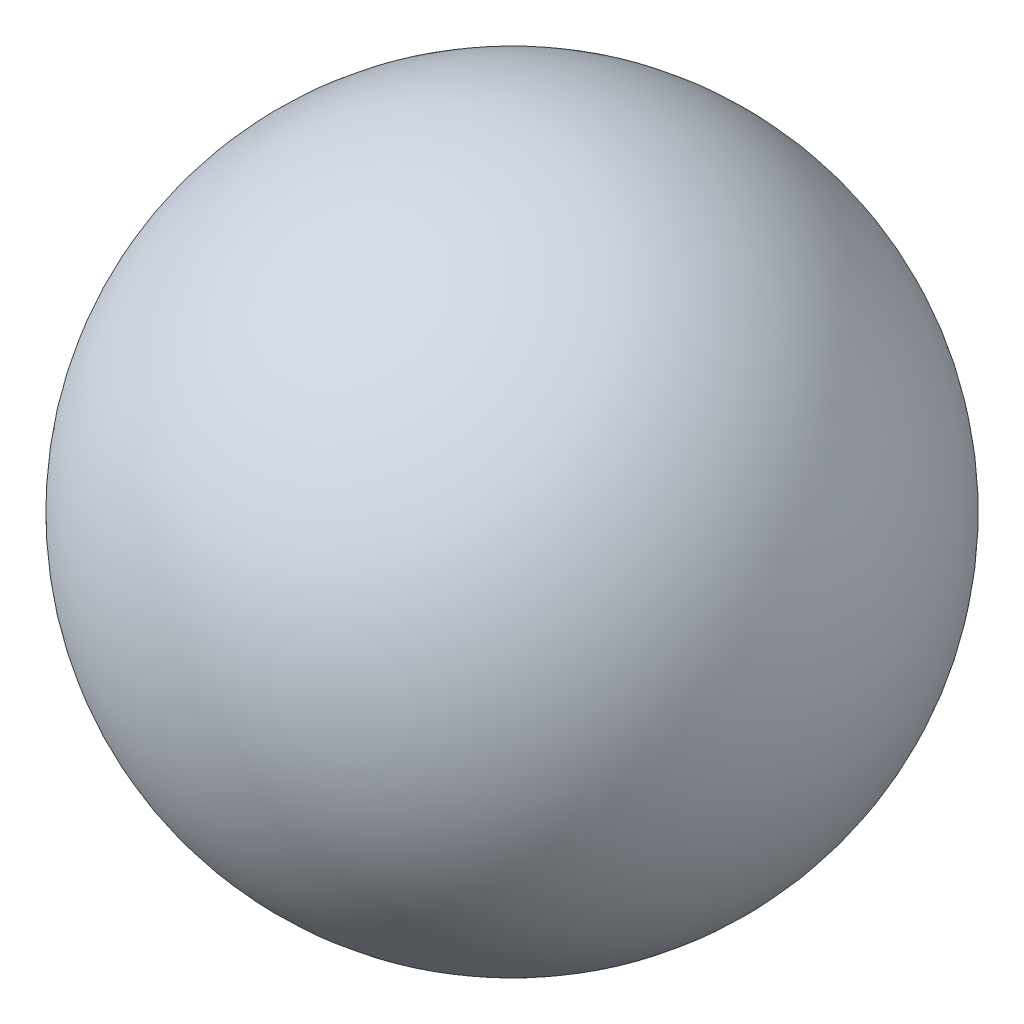
ISO-10303-21;
HEADER;
FILE_DESCRIPTION(('STEP AP214'),'2;1');
FILE_NAME('part.step','',(''),(''),'','','');
FILE_SCHEMA(('AUTOMOTIVE_DESIGN { 1 0 10303 214 1 1 1 1 }'));
ENDSEC;
DATA;
#1=APPLICATION_CONTEXT('core data for automotive mechanical design processes');
#2=APPLICATION_PROTOCOL_DEFINITION('international standard','automotive_design',2000,#1);
#3=PRODUCT_CONTEXT('',#1,'mechanical');
#4=PRODUCT('Part','Part','',(#3));
#5=PRODUCT_RELATED_PRODUCT_CATEGORY('part','',(#4));
#6=PRODUCT_DEFINITION_FORMATION('','',#4);
#7=PRODUCT_DEFINITION_CONTEXT('part definition',#1,'design');
#8=PRODUCT_DEFINITION('design','',#6,#7);
#9=PRODUCT_DEFINITION_SHAPE('','',#8);
#10=(LENGTH_UNIT() NAMED_UNIT(*) SI_UNIT(.MILLI.,.METRE.));
#11=(NAMED_UNIT(*) PLANE_ANGLE_UNIT() SI_UNIT($,.RADIAN.));
#12=(NAMED_UNIT(*) SI_UNIT($,.STERADIAN.) SOLID_ANGLE_UNIT());
#13=UNCERTAINTY_MEASURE_WITH_UNIT(LENGTH_MEASURE(1.E-05),#10,'distance_accuracy_value','');
#14=(GEOMETRIC_REPRESENTATION_CONTEXT(3) GLOBAL_UNCERTAINTY_ASSIGNED_CONTEXT((#13)) GLOBAL_UNIT_ASSIGNED_CONTEXT((#10,
#11,#12)) REPRESENTATION_CONTEXT('',''));
#15=CARTESIAN_POINT('',(0.,0.,0.));
#16=DIRECTION('',(0.,0.,1.));
#17=DIRECTION('',(1.,0.,0.));
#18=AXIS2_PLACEMENT_3D('',#15,#16,#17);
#19=CARTESIAN_POINT('',(0.,0.,0.));
#20=DIRECTION('',(0.,1.,0.));
#21=DIRECTION('',(1.,0.,0.));
#22=AXIS2_PLACEMENT_3D('',#19,#20,#21);
#23=SPHERICAL_SURFACE('',#22,403.);
#24=CARTESIAN_POINT('',(0.,403.,0.));
#25=VERTEX_POINT('',#24);
#26=VERTEX_LOOP('',#25);
#27=FACE_BOUND('',#26,.T.);
#28=ADVANCED_FACE('F33',(#27),#23,.T.);
#29=CLOSED_SHELL('',(#28));
#30=CARTESIAN_POINT('',(0.,0.,0.));
#31=DIRECTION('',(0.,1.,0.));
#32=DIRECTION('',(-1.,0.,0.));
#33=AXIS2_PLACEMENT_3D('',#30,#31,#32);
#34=SPHERICAL_SURFACE('',#33,400.);
#35=CARTESIAN_POINT('',(0.,400.,0.));
#36=VERTEX_POINT('',#35);
#37=VERTEX_LOOP('',#36);
#38=FACE_BOUND('',#37,.T.);
#39=ADVANCED_FACE('F45',(#38),#34,.F.);
#40=CLOSED_SHELL('',(#39));
#41=ORIENTED_CLOSED_SHELL('',*,#40,.T.);
#42=BREP_WITH_VOIDS('B2',#29,(#41));
#43=ADVANCED_BREP_SHAPE_REPRESENTATION('',(#18,#42),#14);
#44=SHAPE_DEFINITION_REPRESENTATION(#9,#43);
ENDSEC;
END-ISO-10303-21;
